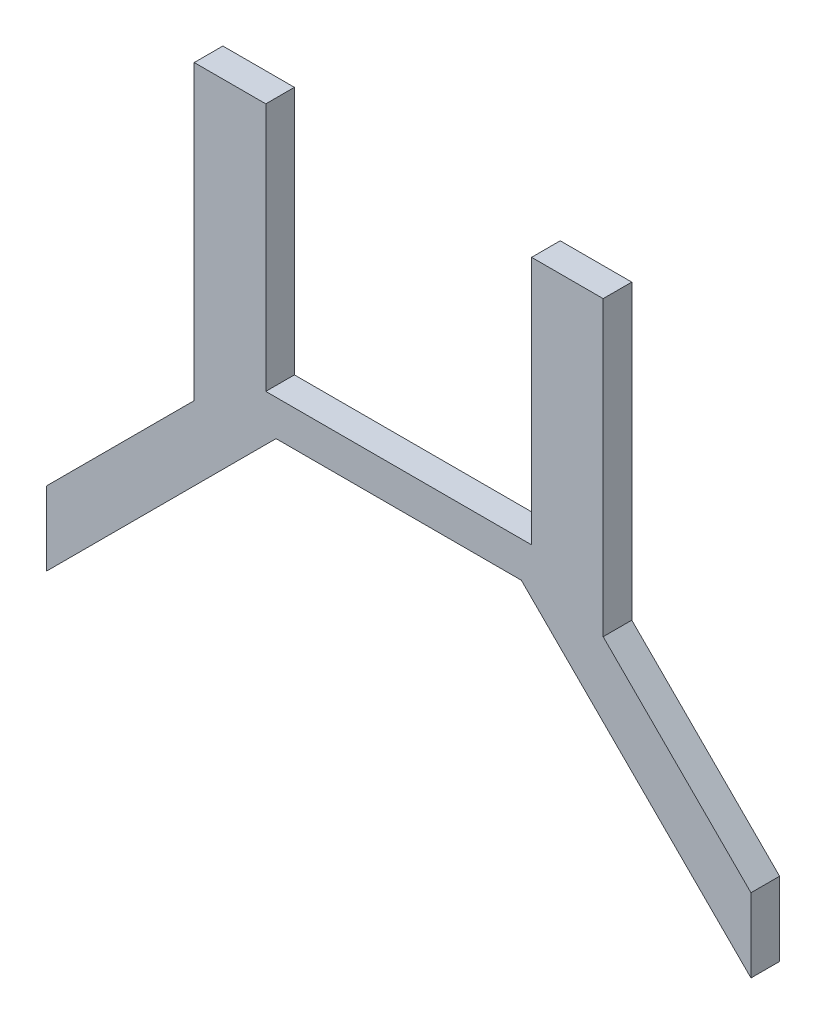
ISO-10303-21;
HEADER;
FILE_DESCRIPTION(('STEP AP214'),'2;1');
FILE_NAME('part.step','',(''),(''),'','','');
FILE_SCHEMA(('AUTOMOTIVE_DESIGN { 1 0 10303 214 1 1 1 1 }'));
ENDSEC;
DATA;
#1=APPLICATION_CONTEXT('core data for automotive mechanical design processes');
#2=APPLICATION_PROTOCOL_DEFINITION('international standard','automotive_design',2000,#1);
#3=PRODUCT_CONTEXT('',#1,'mechanical');
#4=PRODUCT('Part','Part','',(#3));
#5=PRODUCT_RELATED_PRODUCT_CATEGORY('part','',(#4));
#6=PRODUCT_DEFINITION_FORMATION('','',#4);
#7=PRODUCT_DEFINITION_CONTEXT('part definition',#1,'design');
#8=PRODUCT_DEFINITION('design','',#6,#7);
#9=PRODUCT_DEFINITION_SHAPE('','',#8);
#10=(LENGTH_UNIT() NAMED_UNIT(*) SI_UNIT(.MILLI.,.METRE.));
#11=(NAMED_UNIT(*) PLANE_ANGLE_UNIT() SI_UNIT($,.RADIAN.));
#12=(NAMED_UNIT(*) SI_UNIT($,.STERADIAN.) SOLID_ANGLE_UNIT());
#13=UNCERTAINTY_MEASURE_WITH_UNIT(LENGTH_MEASURE(1.E-05),#10,'distance_accuracy_value','');
#14=(GEOMETRIC_REPRESENTATION_CONTEXT(3) GLOBAL_UNCERTAINTY_ASSIGNED_CONTEXT((#13)) GLOBAL_UNIT_ASSIGNED_CONTEXT((#10,
#11,#12)) REPRESENTATION_CONTEXT('',''));
#15=CARTESIAN_POINT('',(0.,0.,0.));
#16=DIRECTION('',(0.,0.,1.));
#17=DIRECTION('',(1.,0.,0.));
#18=AXIS2_PLACEMENT_3D('',#15,#16,#17);
#19=CARTESIAN_POINT('',(-43.9182214777495,109.848159974244,8.));
#20=DIRECTION('',(1.,0.,0.));
#21=DIRECTION('',(0.,1.,0.));
#22=AXIS2_PLACEMENT_3D('',#19,#20,#21);
#23=PLANE('',#22);
#24=DIRECTION('',(0.,-1.,0.));
#25=VECTOR('',#24,1.);
#26=CARTESIAN_POINT('',(-43.9182214777495,109.848159974244,0.));
#27=LINE('',#26,#25);
#28=CARTESIAN_POINT('',(-43.9182214777495,109.848159974244,0.));
#29=VERTEX_POINT('',#28);
#30=CARTESIAN_POINT('',(-43.9182214777495,28.0080667041335,0.));
#31=VERTEX_POINT('',#30);
#32=EDGE_CURVE('E166',#29,#31,#27,.T.);
#33=ORIENTED_EDGE('',*,*,#32,.F.);
#34=DIRECTION('',(0.,0.,-1.));
#35=VECTOR('',#34,1.);
#36=CARTESIAN_POINT('',(-43.9182214777495,109.848159974244,8.));
#37=LINE('',#36,#35);
#38=CARTESIAN_POINT('',(-43.9182214777495,109.848159974244,8.));
#39=VERTEX_POINT('',#38);
#40=EDGE_CURVE('E11',#39,#29,#37,.T.);
#41=ORIENTED_EDGE('',*,*,#40,.F.);
#42=DIRECTION('',(0.,-1.,0.));
#43=VECTOR('',#42,1.);
#44=CARTESIAN_POINT('',(-43.9182214777495,109.848159974244,8.));
#45=LINE('',#44,#43);
#46=CARTESIAN_POINT('',(-43.9182214777495,28.0080667041335,8.));
#47=VERTEX_POINT('',#46);
#48=EDGE_CURVE('E204',#39,#47,#45,.T.);
#49=ORIENTED_EDGE('',*,*,#48,.T.);
#50=DIRECTION('',(0.,0.,-1.));
#51=VECTOR('',#50,1.);
#52=CARTESIAN_POINT('',(-43.9182214777495,28.0080667041335,8.));
#53=LINE('',#52,#51);
#54=EDGE_CURVE('E36',#47,#31,#53,.T.);
#55=ORIENTED_EDGE('',*,*,#54,.T.);
#56=EDGE_LOOP('',(#33,#41,#49,#55));
#57=FACE_BOUND('',#56,.T.);
#58=ADVANCED_FACE('F33',(#57),#23,.T.);
#59=CARTESIAN_POINT('',(-63.9182214777495,109.848159974244,8.));
#60=DIRECTION('',(0.,1.,0.));
#61=DIRECTION('',(0.,0.,1.));
#62=AXIS2_PLACEMENT_3D('',#59,#60,#61);
#63=PLANE('',#62);
#64=DIRECTION('',(1.,0.,0.));
#65=VECTOR('',#64,1.);
#66=CARTESIAN_POINT('',(-63.9182214777495,109.848159974244,0.));
#67=LINE('',#66,#65);
#68=CARTESIAN_POINT('',(-63.9182214777495,109.848159974244,0.));
#69=VERTEX_POINT('',#68);
#70=EDGE_CURVE('E202',#69,#29,#67,.T.);
#71=ORIENTED_EDGE('',*,*,#70,.F.);
#72=DIRECTION('',(0.,0.,-1.));
#73=VECTOR('',#72,1.);
#74=CARTESIAN_POINT('',(-63.9182214777495,109.848159974244,8.));
#75=LINE('',#74,#73);
#76=CARTESIAN_POINT('',(-63.9182214777495,109.848159974244,8.));
#77=VERTEX_POINT('',#76);
#78=EDGE_CURVE('E42',#77,#69,#75,.T.);
#79=ORIENTED_EDGE('',*,*,#78,.F.);
#80=DIRECTION('',(1.,0.,0.));
#81=VECTOR('',#80,1.);
#82=CARTESIAN_POINT('',(-63.9182214777495,109.848159974244,8.));
#83=LINE('',#82,#81);
#84=EDGE_CURVE('E156',#77,#39,#83,.T.);
#85=ORIENTED_EDGE('',*,*,#84,.T.);
#86=ORIENTED_EDGE('',*,*,#40,.T.);
#87=EDGE_LOOP('',(#71,#79,#85,#86));
#88=FACE_BOUND('',#87,.T.);
#89=ADVANCED_FACE('F228',(#88),#63,.T.);
#90=CARTESIAN_POINT('',(-63.9182214777495,40.2371858511899,8.));
#91=DIRECTION('',(-1.,0.,0.));
#92=DIRECTION('',(0.,0.,1.));
#93=AXIS2_PLACEMENT_3D('',#90,#91,#92);
#94=PLANE('',#93);
#95=DIRECTION('',(0.,1.,0.));
#96=VECTOR('',#95,1.);
#97=CARTESIAN_POINT('',(-63.9182214777495,40.2371858511899,0.));
#98=LINE('',#97,#96);
#99=CARTESIAN_POINT('',(-63.9182214777495,40.2371858511899,0.));
#100=VERTEX_POINT('',#99);
#101=EDGE_CURVE('E143',#100,#69,#98,.T.);
#102=ORIENTED_EDGE('',*,*,#101,.F.);
#103=DIRECTION('',(0.,0.,-1.));
#104=VECTOR('',#103,1.);
#105=CARTESIAN_POINT('',(-63.9182214777495,40.2371858511899,8.));
#106=LINE('',#105,#104);
#107=CARTESIAN_POINT('',(-63.9182214777495,40.2371858511899,8.));
#108=VERTEX_POINT('',#107);
#109=EDGE_CURVE('E138',#108,#100,#106,.T.);
#110=ORIENTED_EDGE('',*,*,#109,.F.);
#111=DIRECTION('',(0.,1.,0.));
#112=VECTOR('',#111,1.);
#113=CARTESIAN_POINT('',(-63.9182214777495,40.2371858511899,8.));
#114=LINE('',#113,#112);
#115=EDGE_CURVE('E141',#108,#77,#114,.T.);
#116=ORIENTED_EDGE('',*,*,#115,.T.);
#117=ORIENTED_EDGE('',*,*,#78,.T.);
#118=EDGE_LOOP('',(#102,#110,#116,#117));
#119=FACE_BOUND('',#118,.T.);
#120=ADVANCED_FACE('F140',(#119),#94,.T.);
#121=CARTESIAN_POINT('',(-138.218221477749,40.23718585119,8.));
#122=DIRECTION('',(0.,1.,0.));
#123=DIRECTION('',(-1.,0.,0.));
#124=AXIS2_PLACEMENT_3D('',#121,#122,#123);
#125=PLANE('',#124);
#126=DIRECTION('',(1.,0.,0.));
#127=VECTOR('',#126,1.);
#128=CARTESIAN_POINT('',(-138.218221477749,40.23718585119,0.));
#129=LINE('',#128,#127);
#130=CARTESIAN_POINT('',(-138.218221477749,40.23718585119,0.));
#131=VERTEX_POINT('',#130);
#132=EDGE_CURVE('E199',#131,#100,#129,.T.);
#133=ORIENTED_EDGE('',*,*,#132,.F.);
#134=DIRECTION('',(0.,0.,-1.));
#135=VECTOR('',#134,1.);
#136=CARTESIAN_POINT('',(-138.218221477749,40.23718585119,8.));
#137=LINE('',#136,#135);
#138=CARTESIAN_POINT('',(-138.218221477749,40.23718585119,8.));
#139=VERTEX_POINT('',#138);
#140=EDGE_CURVE('E148',#139,#131,#137,.T.);
#141=ORIENTED_EDGE('',*,*,#140,.F.);
#142=DIRECTION('',(1.,0.,0.));
#143=VECTOR('',#142,1.);
#144=CARTESIAN_POINT('',(-138.218221477749,40.23718585119,8.));
#145=LINE('',#144,#143);
#146=EDGE_CURVE('E154',#139,#108,#145,.T.);
#147=ORIENTED_EDGE('',*,*,#146,.T.);
#148=ORIENTED_EDGE('',*,*,#109,.T.);
#149=EDGE_LOOP('',(#133,#141,#147,#148));
#150=FACE_BOUND('',#149,.T.);
#151=ADVANCED_FACE('F158',(#150),#125,.T.);
#152=CARTESIAN_POINT('',(-138.218221477749,109.848159974244,8.));
#153=DIRECTION('',(1.,0.,0.));
#154=DIRECTION('',(0.,0.,-1.));
#155=AXIS2_PLACEMENT_3D('',#152,#153,#154);
#156=PLANE('',#155);
#157=DIRECTION('',(0.,-1.,0.));
#158=VECTOR('',#157,1.);
#159=CARTESIAN_POINT('',(-138.218221477749,109.848159974244,0.));
#160=LINE('',#159,#158);
#161=CARTESIAN_POINT('',(-138.218221477749,109.848159974244,0.));
#162=VERTEX_POINT('',#161);
#163=EDGE_CURVE('E196',#162,#131,#160,.T.);
#164=ORIENTED_EDGE('',*,*,#163,.F.);
#165=DIRECTION('',(0.,0.,-1.));
#166=VECTOR('',#165,1.);
#167=CARTESIAN_POINT('',(-138.218221477749,109.848159974244,8.));
#168=LINE('',#167,#166);
#169=CARTESIAN_POINT('',(-138.218221477749,109.848159974244,8.));
#170=VERTEX_POINT('',#169);
#171=EDGE_CURVE('E208',#170,#162,#168,.T.);
#172=ORIENTED_EDGE('',*,*,#171,.F.);
#173=DIRECTION('',(0.,-1.,0.));
#174=VECTOR('',#173,1.);
#175=CARTESIAN_POINT('',(-138.218221477749,109.848159974244,8.));
#176=LINE('',#175,#174);
#177=EDGE_CURVE('E159',#170,#139,#176,.T.);
#178=ORIENTED_EDGE('',*,*,#177,.T.);
#179=ORIENTED_EDGE('',*,*,#140,.T.);
#180=EDGE_LOOP('',(#164,#172,#178,#179));
#181=FACE_BOUND('',#180,.T.);
#182=ADVANCED_FACE('F241',(#181),#156,.T.);
#183=CARTESIAN_POINT('',(-158.218221477749,109.848159974244,8.));
#184=DIRECTION('',(0.,1.,0.));
#185=DIRECTION('',(-1.,0.,0.));
#186=AXIS2_PLACEMENT_3D('',#183,#184,#185);
#187=PLANE('',#186);
#188=DIRECTION('',(1.,0.,0.));
#189=VECTOR('',#188,1.);
#190=CARTESIAN_POINT('',(-158.218221477749,109.848159974244,0.));
#191=LINE('',#190,#189);
#192=CARTESIAN_POINT('',(-158.218221477749,109.848159974244,0.));
#193=VERTEX_POINT('',#192);
#194=EDGE_CURVE('E193',#193,#162,#191,.T.);
#195=ORIENTED_EDGE('',*,*,#194,.F.);
#196=DIRECTION('',(0.,0.,-1.));
#197=VECTOR('',#196,1.);
#198=CARTESIAN_POINT('',(-158.218221477749,109.848159974244,8.));
#199=LINE('',#198,#197);
#200=CARTESIAN_POINT('',(-158.218221477749,109.848159974244,8.));
#201=VERTEX_POINT('',#200);
#202=EDGE_CURVE('E210',#201,#193,#199,.T.);
#203=ORIENTED_EDGE('',*,*,#202,.F.);
#204=DIRECTION('',(1.,0.,0.));
#205=VECTOR('',#204,1.);
#206=CARTESIAN_POINT('',(-158.218221477749,109.848159974244,8.));
#207=LINE('',#206,#205);
#208=EDGE_CURVE('E161',#201,#170,#207,.T.);
#209=ORIENTED_EDGE('',*,*,#208,.T.);
#210=ORIENTED_EDGE('',*,*,#171,.T.);
#211=EDGE_LOOP('',(#195,#203,#209,#210));
#212=FACE_BOUND('',#211,.T.);
#213=ADVANCED_FACE('F244',(#212),#187,.T.);
#214=CARTESIAN_POINT('',(-158.218221477749,28.0080667041336,8.));
#215=DIRECTION('',(-1.,0.,0.));
#216=DIRECTION('',(0.,0.,1.));
#217=AXIS2_PLACEMENT_3D('',#214,#215,#216);
#218=PLANE('',#217);
#219=DIRECTION('',(0.,1.,0.));
#220=VECTOR('',#219,1.);
#221=CARTESIAN_POINT('',(-158.218221477749,28.0080667041336,0.));
#222=LINE('',#221,#220);
#223=CARTESIAN_POINT('',(-158.218221477749,28.0080667041336,0.));
#224=VERTEX_POINT('',#223);
#225=EDGE_CURVE('E190',#224,#193,#222,.T.);
#226=ORIENTED_EDGE('',*,*,#225,.F.);
#227=DIRECTION('',(0.,0.,-1.));
#228=VECTOR('',#227,1.);
#229=CARTESIAN_POINT('',(-158.218221477749,28.0080667041336,8.));
#230=LINE('',#229,#228);
#231=CARTESIAN_POINT('',(-158.218221477749,28.0080667041336,8.));
#232=VERTEX_POINT('',#231);
#233=EDGE_CURVE('E212',#232,#224,#230,.T.);
#234=ORIENTED_EDGE('',*,*,#233,.F.);
#235=DIRECTION('',(0.,1.,0.));
#236=VECTOR('',#235,1.);
#237=CARTESIAN_POINT('',(-158.218221477749,28.0080667041336,8.));
#238=LINE('',#237,#236);
#239=EDGE_CURVE('E401',#232,#201,#238,.T.);
#240=ORIENTED_EDGE('',*,*,#239,.T.);
#241=ORIENTED_EDGE('',*,*,#202,.T.);
#242=EDGE_LOOP('',(#226,#234,#240,#241));
#243=FACE_BOUND('',#242,.T.);
#244=ADVANCED_FACE('F248',(#243),#218,.T.);
#245=CARTESIAN_POINT('',(-199.537021393154,-13.310733211271,8.));
#246=DIRECTION('',(-0.707106781186548,0.707106781186548,0.));
#247=DIRECTION('',(-0.707106781186548,-0.707106781186548,0.));
#248=AXIS2_PLACEMENT_3D('',#245,#246,#247);
#249=PLANE('',#248);
#250=DIRECTION('',(0.707106781186548,0.707106781186548,0.));
#251=VECTOR('',#250,1.);
#252=CARTESIAN_POINT('',(-199.537021393154,-13.310733211271,0.));
#253=LINE('',#252,#251);
#254=CARTESIAN_POINT('',(-199.537021393154,-13.310733211271,0.));
#255=VERTEX_POINT('',#254);
#256=EDGE_CURVE('E187',#255,#224,#253,.T.);
#257=ORIENTED_EDGE('',*,*,#256,.F.);
#258=DIRECTION('',(0.,0.,-1.));
#259=VECTOR('',#258,1.);
#260=CARTESIAN_POINT('',(-199.537021393154,-13.310733211271,8.));
#261=LINE('',#260,#259);
#262=CARTESIAN_POINT('',(-199.537021393154,-13.310733211271,8.));
#263=VERTEX_POINT('',#262);
#264=EDGE_CURVE('E214',#263,#255,#261,.T.);
#265=ORIENTED_EDGE('',*,*,#264,.F.);
#266=DIRECTION('',(0.707106781186548,0.707106781186548,0.));
#267=VECTOR('',#266,1.);
#268=CARTESIAN_POINT('',(-199.537021393154,-13.310733211271,8.));
#269=LINE('',#268,#267);
#270=EDGE_CURVE('E394',#263,#232,#269,.T.);
#271=ORIENTED_EDGE('',*,*,#270,.T.);
#272=ORIENTED_EDGE('',*,*,#233,.T.);
#273=EDGE_LOOP('',(#257,#265,#271,#272));
#274=FACE_BOUND('',#273,.T.);
#275=ADVANCED_FACE('F252',(#274),#249,.T.);
#276=CARTESIAN_POINT('',(-199.537021393154,-33.9499415145613,8.));
#277=DIRECTION('',(-1.,0.,0.));
#278=DIRECTION('',(0.,-1.,0.));
#279=AXIS2_PLACEMENT_3D('',#276,#277,#278);
#280=PLANE('',#279);
#281=DIRECTION('',(0.,1.,0.));
#282=VECTOR('',#281,1.);
#283=CARTESIAN_POINT('',(-199.537021393154,-33.9499415145613,0.));
#284=LINE('',#283,#282);
#285=CARTESIAN_POINT('',(-199.537021393154,-33.9499415145613,0.));
#286=VERTEX_POINT('',#285);
#287=EDGE_CURVE('E184',#286,#255,#284,.T.);
#288=ORIENTED_EDGE('',*,*,#287,.F.);
#289=DIRECTION('',(0.,0.,-1.));
#290=VECTOR('',#289,1.);
#291=CARTESIAN_POINT('',(-199.537021393154,-33.9499415145613,8.));
#292=LINE('',#291,#290);
#293=CARTESIAN_POINT('',(-199.537021393154,-33.9499415145613,8.));
#294=VERTEX_POINT('',#293);
#295=EDGE_CURVE('E216',#294,#286,#292,.T.);
#296=ORIENTED_EDGE('',*,*,#295,.F.);
#297=DIRECTION('',(0.,1.,0.));
#298=VECTOR('',#297,1.);
#299=CARTESIAN_POINT('',(-199.537021393154,-33.9499415145613,8.));
#300=LINE('',#299,#298);
#301=EDGE_CURVE('E390',#294,#263,#300,.T.);
#302=ORIENTED_EDGE('',*,*,#301,.T.);
#303=ORIENTED_EDGE('',*,*,#264,.T.);
#304=EDGE_LOOP('',(#288,#296,#302,#303));
#305=FACE_BOUND('',#304,.T.);
#306=ADVANCED_FACE('F256',(#305),#280,.T.);
#307=CARTESIAN_POINT('',(-135.349894027403,30.2371858511899,8.));
#308=DIRECTION('',(0.707106781186547,-0.707106781186548,0.));
#309=DIRECTION('',(0.707106781186548,0.707106781186547,0.));
#310=AXIS2_PLACEMENT_3D('',#307,#308,#309);
#311=PLANE('',#310);
#312=DIRECTION('',(-0.707106781186548,-0.707106781186547,0.));
#313=VECTOR('',#312,1.);
#314=CARTESIAN_POINT('',(-135.349894027403,30.2371858511899,0.));
#315=LINE('',#314,#313);
#316=CARTESIAN_POINT('',(-135.349894027403,30.2371858511899,0.));
#317=VERTEX_POINT('',#316);
#318=EDGE_CURVE('E181',#317,#286,#315,.T.);
#319=ORIENTED_EDGE('',*,*,#318,.F.);
#320=DIRECTION('',(0.,0.,-1.));
#321=VECTOR('',#320,1.);
#322=CARTESIAN_POINT('',(-135.349894027403,30.2371858511899,8.));
#323=LINE('',#322,#321);
#324=CARTESIAN_POINT('',(-135.349894027403,30.2371858511899,8.));
#325=VERTEX_POINT('',#324);
#326=EDGE_CURVE('E218',#325,#317,#323,.T.);
#327=ORIENTED_EDGE('',*,*,#326,.F.);
#328=DIRECTION('',(-0.707106781186548,-0.707106781186547,0.));
#329=VECTOR('',#328,1.);
#330=CARTESIAN_POINT('',(-135.349894027403,30.2371858511899,8.));
#331=LINE('',#330,#329);
#332=EDGE_CURVE('E406',#325,#294,#331,.T.);
#333=ORIENTED_EDGE('',*,*,#332,.T.);
#334=ORIENTED_EDGE('',*,*,#295,.T.);
#335=EDGE_LOOP('',(#319,#327,#333,#334));
#336=FACE_BOUND('',#335,.T.);
#337=ADVANCED_FACE('F260',(#336),#311,.T.);
#338=CARTESIAN_POINT('',(-66.7865489280955,30.2371858511906,8.));
#339=DIRECTION('',(0.,-1.,0.));
#340=DIRECTION('',(1.,0.,0.));
#341=AXIS2_PLACEMENT_3D('',#338,#339,#340);
#342=PLANE('',#341);
#343=DIRECTION('',(-1.,0.,0.));
#344=VECTOR('',#343,1.);
#345=CARTESIAN_POINT('',(-66.7865489280955,30.2371858511906,0.));
#346=LINE('',#345,#344);
#347=CARTESIAN_POINT('',(-66.7865489280955,30.2371858511906,0.));
#348=VERTEX_POINT('',#347);
#349=EDGE_CURVE('E178',#348,#317,#346,.T.);
#350=ORIENTED_EDGE('',*,*,#349,.F.);
#351=DIRECTION('',(0.,0.,-1.));
#352=VECTOR('',#351,1.);
#353=CARTESIAN_POINT('',(-66.7865489280955,30.2371858511906,8.));
#354=LINE('',#353,#352);
#355=CARTESIAN_POINT('',(-66.7865489280955,30.2371858511906,8.));
#356=VERTEX_POINT('',#355);
#357=EDGE_CURVE('E220',#356,#348,#354,.T.);
#358=ORIENTED_EDGE('',*,*,#357,.F.);
#359=DIRECTION('',(-1.,0.,0.));
#360=VECTOR('',#359,1.);
#361=CARTESIAN_POINT('',(-66.7865489280955,30.2371858511906,8.));
#362=LINE('',#361,#360);
#363=EDGE_CURVE('E383',#356,#325,#362,.T.);
#364=ORIENTED_EDGE('',*,*,#363,.T.);
#365=ORIENTED_EDGE('',*,*,#326,.T.);
#366=EDGE_LOOP('',(#350,#358,#364,#365));
#367=FACE_BOUND('',#366,.T.);
#368=ADVANCED_FACE('F264',(#367),#342,.T.);
#369=CARTESIAN_POINT('',(-2.59942156234494,-33.9499415145613,8.));
#370=DIRECTION('',(-0.707106781186555,-0.70710678118654,0.));
#371=DIRECTION('',(0.70710678118654,-0.707106781186555,0.));
#372=AXIS2_PLACEMENT_3D('',#369,#370,#371);
#373=PLANE('',#372);
#374=DIRECTION('',(-0.70710678118654,0.707106781186555,0.));
#375=VECTOR('',#374,1.);
#376=CARTESIAN_POINT('',(-2.59942156234494,-33.9499415145613,0.));
#377=LINE('',#376,#375);
#378=CARTESIAN_POINT('',(-2.59942156234494,-33.9499415145613,0.));
#379=VERTEX_POINT('',#378);
#380=EDGE_CURVE('E175',#379,#348,#377,.T.);
#381=ORIENTED_EDGE('',*,*,#380,.F.);
#382=DIRECTION('',(0.,0.,-1.));
#383=VECTOR('',#382,1.);
#384=CARTESIAN_POINT('',(-2.59942156234494,-33.9499415145613,8.));
#385=LINE('',#384,#383);
#386=CARTESIAN_POINT('',(-2.59942156234494,-33.9499415145613,8.));
#387=VERTEX_POINT('',#386);
#388=EDGE_CURVE('E222',#387,#379,#385,.T.);
#389=ORIENTED_EDGE('',*,*,#388,.F.);
#390=DIRECTION('',(-0.70710678118654,0.707106781186555,0.));
#391=VECTOR('',#390,1.);
#392=CARTESIAN_POINT('',(-2.59942156234494,-33.9499415145613,8.));
#393=LINE('',#392,#391);
#394=EDGE_CURVE('E379',#387,#356,#393,.T.);
#395=ORIENTED_EDGE('',*,*,#394,.T.);
#396=ORIENTED_EDGE('',*,*,#357,.T.);
#397=EDGE_LOOP('',(#381,#389,#395,#396));
#398=FACE_BOUND('',#397,.T.);
#399=ADVANCED_FACE('F268',(#398),#373,.T.);
#400=CARTESIAN_POINT('',(-2.59942156234494,-13.310733211271,8.));
#401=DIRECTION('',(1.,0.,0.));
#402=DIRECTION('',(0.,1.,0.));
#403=AXIS2_PLACEMENT_3D('',#400,#401,#402);
#404=PLANE('',#403);
#405=DIRECTION('',(0.,-1.,0.));
#406=VECTOR('',#405,1.);
#407=CARTESIAN_POINT('',(-2.59942156234494,-13.310733211271,0.));
#408=LINE('',#407,#406);
#409=CARTESIAN_POINT('',(-2.59942156234494,-13.310733211271,0.));
#410=VERTEX_POINT('',#409);
#411=EDGE_CURVE('E172',#410,#379,#408,.T.);
#412=ORIENTED_EDGE('',*,*,#411,.F.);
#413=DIRECTION('',(0.,0.,-1.));
#414=VECTOR('',#413,1.);
#415=CARTESIAN_POINT('',(-2.59942156234494,-13.310733211271,8.));
#416=LINE('',#415,#414);
#417=CARTESIAN_POINT('',(-2.59942156234494,-13.310733211271,8.));
#418=VERTEX_POINT('',#417);
#419=EDGE_CURVE('E223',#418,#410,#416,.T.);
#420=ORIENTED_EDGE('',*,*,#419,.F.);
#421=DIRECTION('',(0.,-1.,0.));
#422=VECTOR('',#421,1.);
#423=CARTESIAN_POINT('',(-2.59942156234494,-13.310733211271,8.));
#424=LINE('',#423,#422);
#425=EDGE_CURVE('E410',#418,#387,#424,.T.);
#426=ORIENTED_EDGE('',*,*,#425,.T.);
#427=ORIENTED_EDGE('',*,*,#388,.T.);
#428=EDGE_LOOP('',(#412,#420,#426,#427));
#429=FACE_BOUND('',#428,.T.);
#430=ADVANCED_FACE('F272',(#429),#404,.T.);
#431=CARTESIAN_POINT('',(-43.9182214777495,28.0080667041335,8.));
#432=DIRECTION('',(0.707106781186547,0.707106781186548,0.));
#433=DIRECTION('',(-0.707106781186548,0.707106781186547,0.));
#434=AXIS2_PLACEMENT_3D('',#431,#432,#433);
#435=PLANE('',#434);
#436=DIRECTION('',(0.707106781186548,-0.707106781186547,0.));
#437=VECTOR('',#436,1.);
#438=CARTESIAN_POINT('',(-43.9182214777495,28.0080667041335,0.));
#439=LINE('',#438,#437);
#440=EDGE_CURVE('E169',#31,#410,#439,.T.);
#441=ORIENTED_EDGE('',*,*,#440,.F.);
#442=ORIENTED_EDGE('',*,*,#54,.F.);
#443=DIRECTION('',(0.707106781186548,-0.707106781186547,0.));
#444=VECTOR('',#443,1.);
#445=CARTESIAN_POINT('',(-43.9182214777495,28.0080667041335,8.));
#446=LINE('',#445,#444);
#447=EDGE_CURVE('E412',#47,#418,#446,.T.);
#448=ORIENTED_EDGE('',*,*,#447,.T.);
#449=ORIENTED_EDGE('',*,*,#419,.T.);
#450=EDGE_LOOP('',(#441,#442,#448,#449));
#451=FACE_BOUND('',#450,.T.);
#452=ADVANCED_FACE('F225',(#451),#435,.T.);
#453=CARTESIAN_POINT('',(0.,0.,8.));
#454=DIRECTION('',(0.,0.,-1.));
#455=DIRECTION('',(-1.,0.,0.));
#456=AXIS2_PLACEMENT_3D('',#453,#454,#455);
#457=PLANE('',#456);
#458=ORIENTED_EDGE('',*,*,#48,.F.);
#459=ORIENTED_EDGE('',*,*,#84,.F.);
#460=ORIENTED_EDGE('',*,*,#115,.F.);
#461=ORIENTED_EDGE('',*,*,#146,.F.);
#462=ORIENTED_EDGE('',*,*,#177,.F.);
#463=ORIENTED_EDGE('',*,*,#208,.F.);
#464=ORIENTED_EDGE('',*,*,#239,.F.);
#465=ORIENTED_EDGE('',*,*,#270,.F.);
#466=ORIENTED_EDGE('',*,*,#301,.F.);
#467=ORIENTED_EDGE('',*,*,#332,.F.);
#468=ORIENTED_EDGE('',*,*,#363,.F.);
#469=ORIENTED_EDGE('',*,*,#394,.F.);
#470=ORIENTED_EDGE('',*,*,#425,.F.);
#471=ORIENTED_EDGE('',*,*,#447,.F.);
#472=EDGE_LOOP('',(#458,#459,#460,#461,#462,#463,#464,#465,#466,#467,#468,#469,#470,#471));
#473=FACE_BOUND('',#472,.T.);
#474=ADVANCED_FACE('F152',(#473),#457,.F.);
#475=CARTESIAN_POINT('',(0.,0.,0.));
#476=DIRECTION('',(0.,0.,-1.));
#477=DIRECTION('',(-1.,0.,0.));
#478=AXIS2_PLACEMENT_3D('',#475,#476,#477);
#479=PLANE('',#478);
#480=ORIENTED_EDGE('',*,*,#32,.T.);
#481=ORIENTED_EDGE('',*,*,#440,.T.);
#482=ORIENTED_EDGE('',*,*,#411,.T.);
#483=ORIENTED_EDGE('',*,*,#380,.T.);
#484=ORIENTED_EDGE('',*,*,#349,.T.);
#485=ORIENTED_EDGE('',*,*,#318,.T.);
#486=ORIENTED_EDGE('',*,*,#287,.T.);
#487=ORIENTED_EDGE('',*,*,#256,.T.);
#488=ORIENTED_EDGE('',*,*,#225,.T.);
#489=ORIENTED_EDGE('',*,*,#194,.T.);
#490=ORIENTED_EDGE('',*,*,#163,.T.);
#491=ORIENTED_EDGE('',*,*,#132,.T.);
#492=ORIENTED_EDGE('',*,*,#101,.T.);
#493=ORIENTED_EDGE('',*,*,#70,.T.);
#494=EDGE_LOOP('',(#480,#481,#482,#483,#484,#485,#486,#487,#488,#489,#490,#491,#492,#493));
#495=FACE_BOUND('',#494,.T.);
#496=ADVANCED_FACE('F227',(#495),#479,.T.);
#497=CLOSED_SHELL('',(#58,#89,#120,#151,#182,#213,#244,#275,#306,#337,#368,#399,#430,#452,#474,#496));
#498=MANIFOLD_SOLID_BREP('B2',#497);
#499=ADVANCED_BREP_SHAPE_REPRESENTATION('',(#18,#498),#14);
#500=SHAPE_DEFINITION_REPRESENTATION(#9,#499);
ENDSEC;
END-ISO-10303-21;
